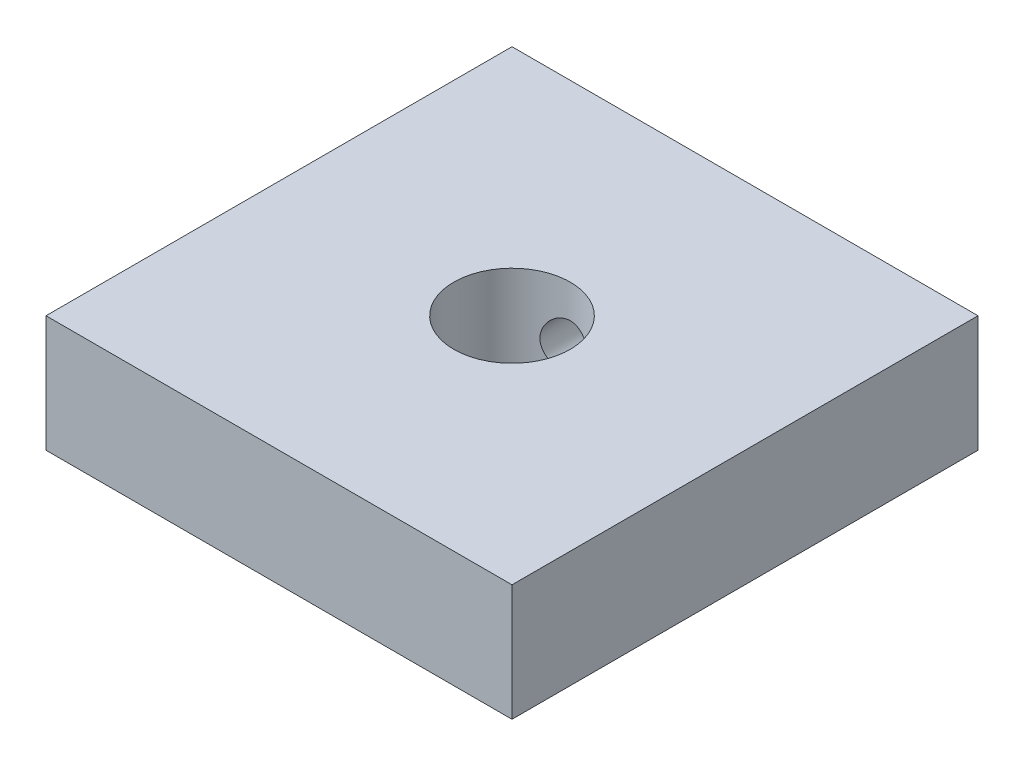
ISO-10303-21;
HEADER;
FILE_DESCRIPTION(('STEP AP214'),'2;1');
FILE_NAME('part.step','',(''),(''),'','','');
FILE_SCHEMA(('AUTOMOTIVE_DESIGN { 1 0 10303 214 1 1 1 1 }'));
ENDSEC;
DATA;
#1=APPLICATION_CONTEXT('core data for automotive mechanical design processes');
#2=APPLICATION_PROTOCOL_DEFINITION('international standard','automotive_design',2000,#1);
#3=PRODUCT_CONTEXT('',#1,'mechanical');
#4=PRODUCT('Part','Part','',(#3));
#5=PRODUCT_RELATED_PRODUCT_CATEGORY('part','',(#4));
#6=PRODUCT_DEFINITION_FORMATION('','',#4);
#7=PRODUCT_DEFINITION_CONTEXT('part definition',#1,'design');
#8=PRODUCT_DEFINITION('design','',#6,#7);
#9=PRODUCT_DEFINITION_SHAPE('','',#8);
#10=(LENGTH_UNIT() NAMED_UNIT(*) SI_UNIT(.MILLI.,.METRE.));
#11=(NAMED_UNIT(*) PLANE_ANGLE_UNIT() SI_UNIT($,.RADIAN.));
#12=(NAMED_UNIT(*) SI_UNIT($,.STERADIAN.) SOLID_ANGLE_UNIT());
#13=UNCERTAINTY_MEASURE_WITH_UNIT(LENGTH_MEASURE(1.E-05),#10,'distance_accuracy_value','');
#14=(GEOMETRIC_REPRESENTATION_CONTEXT(3) GLOBAL_UNCERTAINTY_ASSIGNED_CONTEXT((#13)) GLOBAL_UNIT_ASSIGNED_CONTEXT((#10,
#11,#12)) REPRESENTATION_CONTEXT('',''));
#15=CARTESIAN_POINT('',(0.,0.,0.));
#16=DIRECTION('',(0.,0.,1.));
#17=DIRECTION('',(1.,0.,0.));
#18=AXIS2_PLACEMENT_3D('',#15,#16,#17);
#19=CARTESIAN_POINT('',(12.7,6.35,12.7));
#20=DIRECTION('',(-1.,0.,0.));
#21=DIRECTION('',(0.,0.,1.));
#22=AXIS2_PLACEMENT_3D('',#19,#20,#21);
#23=PLANE('',#22);
#24=DIRECTION('',(0.,0.,-1.));
#25=VECTOR('',#24,1.);
#26=CARTESIAN_POINT('',(12.7,0.,12.7));
#27=LINE('',#26,#25);
#28=CARTESIAN_POINT('',(12.7,0.,12.7));
#29=VERTEX_POINT('',#28);
#30=CARTESIAN_POINT('',(12.7,0.,-12.7));
#31=VERTEX_POINT('',#30);
#32=EDGE_CURVE('E100',#29,#31,#27,.T.);
#33=ORIENTED_EDGE('',*,*,#32,.T.);
#34=DIRECTION('',(0.,-1.,0.));
#35=VECTOR('',#34,1.);
#36=CARTESIAN_POINT('',(12.7,6.35,-12.7));
#37=LINE('',#36,#35);
#38=CARTESIAN_POINT('',(12.7,6.35,-12.7));
#39=VERTEX_POINT('',#38);
#40=EDGE_CURVE('E11',#39,#31,#37,.T.);
#41=ORIENTED_EDGE('',*,*,#40,.F.);
#42=DIRECTION('',(0.,0.,-1.));
#43=VECTOR('',#42,1.);
#44=CARTESIAN_POINT('',(12.7,6.35,12.7));
#45=LINE('',#44,#43);
#46=CARTESIAN_POINT('',(12.7,6.35,12.7));
#47=VERTEX_POINT('',#46);
#48=EDGE_CURVE('E88',#47,#39,#45,.T.);
#49=ORIENTED_EDGE('',*,*,#48,.F.);
#50=DIRECTION('',(0.,-1.,0.));
#51=VECTOR('',#50,1.);
#52=CARTESIAN_POINT('',(12.7,6.35,12.7));
#53=LINE('',#52,#51);
#54=EDGE_CURVE('E96',#47,#29,#53,.T.);
#55=ORIENTED_EDGE('',*,*,#54,.T.);
#56=EDGE_LOOP('',(#33,#41,#49,#55));
#57=FACE_BOUND('',#56,.T.);
#58=ADVANCED_FACE('F37',(#57),#23,.F.);
#59=CARTESIAN_POINT('',(-12.7,6.35,-12.7));
#60=DIRECTION('',(0.,0.,1.));
#61=DIRECTION('',(1.,0.,0.));
#62=AXIS2_PLACEMENT_3D('',#59,#60,#61);
#63=PLANE('',#62);
#64=CARTESIAN_POINT('',(0.,3.175,-12.7));
#65=DIRECTION('',(0.,0.,-1.));
#66=DIRECTION('',(-1.,0.,0.));
#67=AXIS2_PLACEMENT_3D('',#64,#65,#66);
#68=CIRCLE('',#67,1.35254999999999);
#69=CARTESIAN_POINT('',(-1.35254999999998,3.175,-12.7));
#70=VERTEX_POINT('',#69);
#71=EDGE_CURVE('E127',#70,#70,#68,.T.);
#72=ORIENTED_EDGE('',*,*,#71,.F.);
#73=EDGE_LOOP('',(#72));
#74=FACE_BOUND('',#73,.T.);
#75=DIRECTION('',(-1.,0.,0.));
#76=VECTOR('',#75,1.);
#77=CARTESIAN_POINT('',(-12.7,0.,-12.7));
#78=LINE('',#77,#76);
#79=CARTESIAN_POINT('',(-12.7,0.,-12.7));
#80=VERTEX_POINT('',#79);
#81=EDGE_CURVE('E92',#31,#80,#78,.T.);
#82=ORIENTED_EDGE('',*,*,#81,.T.);
#83=DIRECTION('',(0.,-1.,0.));
#84=VECTOR('',#83,1.);
#85=CARTESIAN_POINT('',(-12.7,6.35,-12.7));
#86=LINE('',#85,#84);
#87=CARTESIAN_POINT('',(-12.7,6.35,-12.7));
#88=VERTEX_POINT('',#87);
#89=EDGE_CURVE('E45',#88,#80,#86,.T.);
#90=ORIENTED_EDGE('',*,*,#89,.F.);
#91=DIRECTION('',(-1.,0.,0.));
#92=VECTOR('',#91,1.);
#93=CARTESIAN_POINT('',(-12.7,6.35,-12.7));
#94=LINE('',#93,#92);
#95=EDGE_CURVE('E83',#39,#88,#94,.T.);
#96=ORIENTED_EDGE('',*,*,#95,.F.);
#97=ORIENTED_EDGE('',*,*,#40,.T.);
#98=EDGE_LOOP('',(#82,#90,#96,#97));
#99=FACE_BOUND('',#98,.T.);
#100=ADVANCED_FACE('F91',(#74,#99),#63,.F.);
#101=CARTESIAN_POINT('',(-12.7,6.35,12.7));
#102=DIRECTION('',(1.,0.,0.));
#103=DIRECTION('',(0.,0.,-1.));
#104=AXIS2_PLACEMENT_3D('',#101,#102,#103);
#105=PLANE('',#104);
#106=DIRECTION('',(0.,0.,1.));
#107=VECTOR('',#106,1.);
#108=CARTESIAN_POINT('',(-12.7,0.,12.7));
#109=LINE('',#108,#107);
#110=CARTESIAN_POINT('',(-12.7,0.,12.7));
#111=VERTEX_POINT('',#110);
#112=EDGE_CURVE('E70',#80,#111,#109,.T.);
#113=ORIENTED_EDGE('',*,*,#112,.T.);
#114=DIRECTION('',(0.,-1.,0.));
#115=VECTOR('',#114,1.);
#116=CARTESIAN_POINT('',(-12.7,6.35,12.7));
#117=LINE('',#116,#115);
#118=CARTESIAN_POINT('',(-12.7,6.35,12.7));
#119=VERTEX_POINT('',#118);
#120=EDGE_CURVE('E93',#119,#111,#117,.T.);
#121=ORIENTED_EDGE('',*,*,#120,.F.);
#122=DIRECTION('',(0.,0.,1.));
#123=VECTOR('',#122,1.);
#124=CARTESIAN_POINT('',(-12.7,6.35,12.7));
#125=LINE('',#124,#123);
#126=EDGE_CURVE('E86',#88,#119,#125,.T.);
#127=ORIENTED_EDGE('',*,*,#126,.F.);
#128=ORIENTED_EDGE('',*,*,#89,.T.);
#129=EDGE_LOOP('',(#113,#121,#127,#128));
#130=FACE_BOUND('',#129,.T.);
#131=ADVANCED_FACE('F94',(#130),#105,.F.);
#132=CARTESIAN_POINT('',(-12.7,6.35,12.7));
#133=DIRECTION('',(0.,0.,-1.));
#134=DIRECTION('',(-1.,0.,0.));
#135=AXIS2_PLACEMENT_3D('',#132,#133,#134);
#136=PLANE('',#135);
#137=DIRECTION('',(1.,0.,0.));
#138=VECTOR('',#137,1.);
#139=CARTESIAN_POINT('',(-12.7,0.,12.7));
#140=LINE('',#139,#138);
#141=EDGE_CURVE('E76',#111,#29,#140,.T.);
#142=ORIENTED_EDGE('',*,*,#141,.T.);
#143=ORIENTED_EDGE('',*,*,#54,.F.);
#144=DIRECTION('',(1.,0.,0.));
#145=VECTOR('',#144,1.);
#146=CARTESIAN_POINT('',(-12.7,6.35,12.7));
#147=LINE('',#146,#145);
#148=EDGE_CURVE('E53',#119,#47,#147,.T.);
#149=ORIENTED_EDGE('',*,*,#148,.F.);
#150=ORIENTED_EDGE('',*,*,#120,.T.);
#151=EDGE_LOOP('',(#142,#143,#149,#150));
#152=FACE_BOUND('',#151,.T.);
#153=ADVANCED_FACE('F108',(#152),#136,.F.);
#154=CARTESIAN_POINT('',(0.,6.35,0.));
#155=DIRECTION('',(0.,-1.,0.));
#156=DIRECTION('',(0.,0.,-1.));
#157=AXIS2_PLACEMENT_3D('',#154,#155,#156);
#158=PLANE('',#157);
#159=CARTESIAN_POINT('',(0.,6.35,0.));
#160=DIRECTION('',(0.,1.,0.));
#161=DIRECTION('',(0.,0.,1.));
#162=AXIS2_PLACEMENT_3D('',#159,#160,#161);
#163=CIRCLE('',#162,3.175);
#164=CARTESIAN_POINT('',(0.,6.35,3.175));
#165=VERTEX_POINT('',#164);
#166=EDGE_CURVE('E114',#165,#165,#163,.T.);
#167=ORIENTED_EDGE('',*,*,#166,.F.);
#168=EDGE_LOOP('',(#167));
#169=FACE_BOUND('',#168,.T.);
#170=ORIENTED_EDGE('',*,*,#48,.T.);
#171=ORIENTED_EDGE('',*,*,#95,.T.);
#172=ORIENTED_EDGE('',*,*,#126,.T.);
#173=ORIENTED_EDGE('',*,*,#148,.T.);
#174=EDGE_LOOP('',(#170,#171,#172,#173));
#175=FACE_BOUND('',#174,.T.);
#176=ADVANCED_FACE('F84',(#169,#175),#158,.F.);
#177=CARTESIAN_POINT('',(0.,0.,0.));
#178=DIRECTION('',(0.,-1.,0.));
#179=DIRECTION('',(0.,0.,-1.));
#180=AXIS2_PLACEMENT_3D('',#177,#178,#179);
#181=PLANE('',#180);
#182=CARTESIAN_POINT('',(0.,0.,0.));
#183=DIRECTION('',(0.,1.,0.));
#184=DIRECTION('',(0.,0.,1.));
#185=AXIS2_PLACEMENT_3D('',#182,#183,#184);
#186=CIRCLE('',#185,3.175);
#187=CARTESIAN_POINT('',(0.,0.,3.175));
#188=VERTEX_POINT('',#187);
#189=EDGE_CURVE('E103',#188,#188,#186,.T.);
#190=ORIENTED_EDGE('',*,*,#189,.T.);
#191=EDGE_LOOP('',(#190));
#192=FACE_BOUND('',#191,.T.);
#193=ORIENTED_EDGE('',*,*,#32,.F.);
#194=ORIENTED_EDGE('',*,*,#141,.F.);
#195=ORIENTED_EDGE('',*,*,#112,.F.);
#196=ORIENTED_EDGE('',*,*,#81,.F.);
#197=EDGE_LOOP('',(#193,#194,#195,#196));
#198=FACE_BOUND('',#197,.T.);
#199=ADVANCED_FACE('F111',(#192,#198),#181,.T.);
#200=CARTESIAN_POINT('',(0.,0.,0.));
#201=DIRECTION('',(0.,1.,0.));
#202=DIRECTION('',(0.,0.,1.));
#203=AXIS2_PLACEMENT_3D('',#200,#201,#202);
#204=CYLINDRICAL_SURFACE('',#203,3.175);
#205=CARTESIAN_POINT('',(-1.35254999999999,3.175,-2.87249603959693));
#206=CARTESIAN_POINT('',(-1.35254144973817,3.24697439996281,-2.87250445815005));
#207=CARTESIAN_POINT('',(-1.3467685418138,3.31905934294395,-2.87524078554433));
#208=CARTESIAN_POINT('',(-1.32390472301707,3.46113880540133,-2.88583587173885));
#209=CARTESIAN_POINT('',(-1.30678372782736,3.5311272500817,-2.89370824556864));
#210=CARTESIAN_POINT('',(-1.26202139757476,3.66669722563847,-2.91350625688248));
#211=CARTESIAN_POINT('',(-1.23442426911595,3.73229593033125,-2.92541484027272));
#212=CARTESIAN_POINT('',(-1.16962319176785,3.85791446066208,-2.95191923353497));
#213=CARTESIAN_POINT('',(-1.1324212128083,3.91793542685094,-2.96651449220093));
#214=CARTESIAN_POINT('',(-1.04687753036052,4.03463753587342,-2.99780972236681));
#215=CARTESIAN_POINT('',(-0.998007650950672,4.09091202821952,-3.01458309027081));
#216=CARTESIAN_POINT('',(-0.891623419067592,4.19476884191495,-3.04774273550043));
#217=CARTESIAN_POINT('',(-0.834105660803416,4.24234772224499,-3.06412885736175));
#218=CARTESIAN_POINT('',(-0.708832201254585,4.32957037479622,-3.09556678978025));
#219=CARTESIAN_POINT('',(-0.6407287457698,4.36875213107786,-3.11052339695066));
#220=CARTESIAN_POINT('',(-0.498144267456611,4.43492557326258,-3.13651336231293));
#221=CARTESIAN_POINT('',(-0.423666216452561,4.46192290309334,-3.14754853644047));
#222=CARTESIAN_POINT('',(-0.274720530054642,4.50147341838428,-3.16393095076387));
#223=CARTESIAN_POINT('',(-0.200470343686463,4.51472905810042,-3.1695536267464));
#224=CARTESIAN_POINT('',(-0.0506011268794795,4.52869425276906,-3.17548089831559));
#225=CARTESIAN_POINT('',(0.0250173079339203,4.52940914139815,-3.17578775475994));
#226=CARTESIAN_POINT('',(0.170351445380157,4.51863075144995,-3.17120780183308));
#227=CARTESIAN_POINT('',(0.240136825877214,4.50791057143761,-3.16664987730867));
#228=CARTESIAN_POINT('',(0.37680780969805,4.47589757018321,-3.15330892931183));
#229=CARTESIAN_POINT('',(0.443693198428222,4.45460396797588,-3.14452559374711));
#230=CARTESIAN_POINT('',(0.573900220275743,4.40180199559313,-3.12340905556976));
#231=CARTESIAN_POINT('',(0.637151675460901,4.37014233214853,-3.11102359884815));
#232=CARTESIAN_POINT('',(0.757610412419927,4.29765937016887,-3.08390486906158));
#233=CARTESIAN_POINT('',(0.814815518800635,4.25683278989749,-3.06917075573197));
#234=CARTESIAN_POINT('',(0.926009825193896,4.16370319895351,-3.03755045100006));
#235=CARTESIAN_POINT('',(0.979456996214031,4.11077882192359,-3.02058567644516));
#236=CARTESIAN_POINT('',(1.076958220301,3.99669734280156,-2.9872139594125));
#237=CARTESIAN_POINT('',(1.12100831420207,3.9355367882855,-2.97080725449735));
#238=CARTESIAN_POINT('',(1.19994681702708,3.80397400619634,-2.93983313651332));
#239=CARTESIAN_POINT('',(1.23445242881002,3.73331996444505,-2.92535219447963));
#240=CARTESIAN_POINT('',(1.29085203406513,3.58642402014534,-2.90091053304645));
#241=CARTESIAN_POINT('',(1.31275551959243,3.5101863721508,-2.89094641273207));
#242=CARTESIAN_POINT('',(1.34191654996036,3.35972740337302,-2.87752106940411));
#243=CARTESIAN_POINT('',(1.35005610128121,3.28571255715327,-2.87366929900739));
#244=CARTESIAN_POINT('',(1.35405865381079,3.1372902164872,-2.87178659142678));
#245=CARTESIAN_POINT('',(1.34992623320313,3.06288287880222,-2.87375348353076));
#246=CARTESIAN_POINT('',(1.33030795737817,2.92114542418166,-2.88288151952897));
#247=CARTESIAN_POINT('',(1.31561627332654,2.85367889392672,-2.88967897083068));
#248=CARTESIAN_POINT('',(1.27636171817341,2.72223060567348,-2.90722969630254));
#249=CARTESIAN_POINT('',(1.25179646925808,2.65824969132077,-2.91798392331542));
#250=CARTESIAN_POINT('',(1.19231804076598,2.53249231692437,-2.94280149492989));
#251=CARTESIAN_POINT('',(1.15700328929164,2.47093085604744,-2.95698783510289));
#252=CARTESIAN_POINT('',(1.07742176647724,2.35430336393195,-2.98690353910626));
#253=CARTESIAN_POINT('',(1.03315099994055,2.29924024896496,-3.00263358995372));
#254=CARTESIAN_POINT('',(0.93243924411195,2.1922503561928,-3.03549303534348));
#255=CARTESIAN_POINT('',(0.87527980908486,2.14099843308407,-3.0526266530558));
#256=CARTESIAN_POINT('',(0.752783452759463,2.04868306602107,-3.08511804796207));
#257=CARTESIAN_POINT('',(0.687445763087604,2.0076205804801,-3.10047565803315));
#258=CARTESIAN_POINT('',(0.549837467638579,1.93682412052872,-3.12781706497259));
#259=CARTESIAN_POINT('',(0.47753775870774,1.90714053519915,-3.13978579518253));
#260=CARTESIAN_POINT('',(0.328327386129404,1.86058384247354,-3.1588713147082));
#261=CARTESIAN_POINT('',(0.251419637482491,1.84370272677894,-3.16599113686515));
#262=CARTESIAN_POINT('',(0.101193697119287,1.82427157609654,-3.17421351375917));
#263=CARTESIAN_POINT('',(0.0280194600816324,1.82077134581019,-3.17571486464925));
#264=CARTESIAN_POINT('',(-0.117854037913367,1.82562073889425,-3.17364965080018));
#265=CARTESIAN_POINT('',(-0.190553386339707,1.83396811449226,-3.17008404738253));
#266=CARTESIAN_POINT('',(-0.330533446507565,1.86159372635063,-3.15849994963124));
#267=CARTESIAN_POINT('',(-0.397915046232629,1.88044077252856,-3.15065735122577));
#268=CARTESIAN_POINT('',(-0.528526234603925,1.92804932896604,-3.13139697478611));
#269=CARTESIAN_POINT('',(-0.591755050971628,1.95681267714529,-3.11997853402962));
#270=CARTESIAN_POINT('',(-0.71544376647083,2.02489526893622,-3.0940169100408));
#271=CARTESIAN_POINT('',(-0.775646343481708,2.06463566521223,-3.07935508319913));
#272=CARTESIAN_POINT('',(-0.888788668130327,2.15294268198073,-3.04862632156219));
#273=CARTESIAN_POINT('',(-0.941725564408732,2.20151275032598,-3.03255883915572));
#274=CARTESIAN_POINT('',(-1.04278397473121,2.31019616892586,-2.99937580691202));
#275=CARTESIAN_POINT('',(-1.09028886025275,2.37088719206082,-2.98226763316533));
#276=CARTESIAN_POINT('',(-1.17454440741523,2.49989129727983,-2.95010375613202));
#277=CARTESIAN_POINT('',(-1.21128887053992,2.56820874137477,-2.93504923850575));
#278=CARTESIAN_POINT('',(-1.27268140564014,2.71059673421658,-2.90895552236199));
#279=CARTESIAN_POINT('',(-1.29736102815264,2.78465168427935,-2.89790587060044));
#280=CARTESIAN_POINT('',(-1.33359544713888,2.93635366945558,-2.88141657281057));
#281=CARTESIAN_POINT('',(-1.34519426706475,3.01398773513497,-2.8759581153381));
#282=CARTESIAN_POINT('',(-1.3517030805325,3.11962599917834,-2.87289346863196));
#283=CARTESIAN_POINT('',(-1.35255329007363,3.14730481581319,-2.87249280020376));
#284=CARTESIAN_POINT('',(-1.35254999999999,3.175,-2.87249603959693));
#285=B_SPLINE_CURVE_WITH_KNOTS('',3,(#205,#206,#207,#208,#209,#210,#211,#212,#213,#214,#215,
#216,#217,#218,#219,#220,#221,#222,#223,#224,#225,#226,#227,#228,#229,#230,#231,#232,#233,#234,
#235,#236,#237,#238,#239,#240,#241,#242,#243,#244,#245,#246,#247,#248,#249,#250,#251,#252,#253,
#254,#255,#256,#257,#258,#259,#260,#261,#262,#263,#264,#265,#266,#267,#268,#269,#270,#271,#272,
#273,#274,#275,#276,#277,#278,#279,#280,#281,#282,#283,#284),.UNSPECIFIED.,.T.,.F.,(4,2,2,2,2,2,
2,2,2,2,2,2,2,2,2,2,2,2,2,2,2,2,2,2,2,2,2,2,2,2,2,2,2,2,2,2,2,2,2,4),(0.,0.21584101702448,
0.432256539765401,0.64776881679723,0.863236927888205,1.09143146099038,1.3197161004133,
1.55843359843098,1.79704040674267,2.02273771494572,2.24833903004246,2.45960046429092,
2.67087750487629,2.88538690608463,3.09997322398205,3.33026922190857,3.56066205708487,
3.79927211992554,4.03770222305692,4.26017678293178,4.4825683568431,4.68978076943018,
4.89704311413886,5.11326891832658,5.32959139241509,5.5644812460425,5.79939318492191,
6.03533368522678,6.27112647621923,6.48982581152621,6.70848365991784,6.91876136736692,
7.12907806934212,7.34897495931778,7.5689579008499,7.80469983588875,8.04057730359199,
8.27583458821619,8.5102977291706,8.59335165841002),.UNSPECIFIED.);
#286=CARTESIAN_POINT('',(-1.35254999999999,3.175,-2.87249603959693));
#287=VERTEX_POINT('',#286);
#288=EDGE_CURVE('E117',#287,#287,#285,.T.);
#289=ORIENTED_EDGE('',*,*,#288,.T.);
#290=EDGE_LOOP('',(#289));
#291=FACE_BOUND('',#290,.T.);
#292=ORIENTED_EDGE('',*,*,#189,.F.);
#293=EDGE_LOOP('',(#292));
#294=FACE_BOUND('',#293,.T.);
#295=ORIENTED_EDGE('',*,*,#166,.T.);
#296=EDGE_LOOP('',(#295));
#297=FACE_BOUND('',#296,.T.);
#298=ADVANCED_FACE('F133',(#291,#294,#297),#204,.F.);
#299=CARTESIAN_POINT('',(0.,3.175,-12.7));
#300=DIRECTION('',(0.,0.,-1.));
#301=DIRECTION('',(-1.,0.,0.));
#302=AXIS2_PLACEMENT_3D('',#299,#300,#301);
#303=CYLINDRICAL_SURFACE('',#302,1.35254999999999);
#304=ORIENTED_EDGE('',*,*,#288,.F.);
#305=EDGE_LOOP('',(#304));
#306=FACE_BOUND('',#305,.T.);
#307=ORIENTED_EDGE('',*,*,#71,.T.);
#308=EDGE_LOOP('',(#307));
#309=FACE_BOUND('',#308,.T.);
#310=ADVANCED_FACE('F130',(#306,#309),#303,.F.);
#311=CLOSED_SHELL('',(#58,#100,#131,#153,#176,#199,#298,#310));
#312=MANIFOLD_SOLID_BREP('B2',#311);
#313=ADVANCED_BREP_SHAPE_REPRESENTATION('',(#18,#312),#14);
#314=SHAPE_DEFINITION_REPRESENTATION(#9,#313);
ENDSEC;
END-ISO-10303-21;
